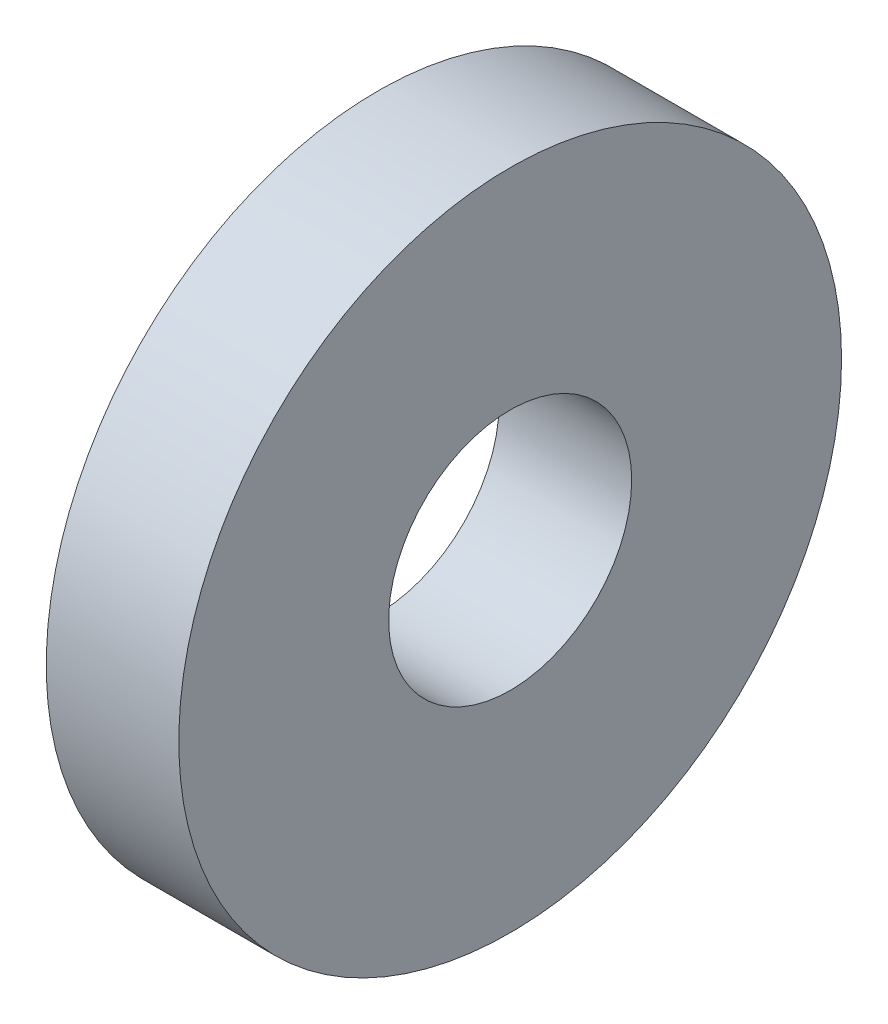
ISO-10303-21;
HEADER;
FILE_DESCRIPTION(('STEP AP214'),'2;1');
FILE_NAME('part.step','',(''),(''),'','','');
FILE_SCHEMA(('AUTOMOTIVE_DESIGN { 1 0 10303 214 1 1 1 1 }'));
ENDSEC;
DATA;
#1=APPLICATION_CONTEXT('core data for automotive mechanical design processes');
#2=APPLICATION_PROTOCOL_DEFINITION('international standard','automotive_design',2000,#1);
#3=PRODUCT_CONTEXT('',#1,'mechanical');
#4=PRODUCT('Part','Part','',(#3));
#5=PRODUCT_RELATED_PRODUCT_CATEGORY('part','',(#4));
#6=PRODUCT_DEFINITION_FORMATION('','',#4);
#7=PRODUCT_DEFINITION_CONTEXT('part definition',#1,'design');
#8=PRODUCT_DEFINITION('design','',#6,#7);
#9=PRODUCT_DEFINITION_SHAPE('','',#8);
#10=(LENGTH_UNIT() NAMED_UNIT(*) SI_UNIT(.MILLI.,.METRE.));
#11=(NAMED_UNIT(*) PLANE_ANGLE_UNIT() SI_UNIT($,.RADIAN.));
#12=(NAMED_UNIT(*) SI_UNIT($,.STERADIAN.) SOLID_ANGLE_UNIT());
#13=UNCERTAINTY_MEASURE_WITH_UNIT(LENGTH_MEASURE(1.E-05),#10,'distance_accuracy_value','');
#14=(GEOMETRIC_REPRESENTATION_CONTEXT(3) GLOBAL_UNCERTAINTY_ASSIGNED_CONTEXT((#13)) GLOBAL_UNIT_ASSIGNED_CONTEXT((#10,
#11,#12)) REPRESENTATION_CONTEXT('',''));
#15=CARTESIAN_POINT('',(0.,0.,0.));
#16=DIRECTION('',(0.,0.,1.));
#17=DIRECTION('',(1.,0.,0.));
#18=AXIS2_PLACEMENT_3D('',#15,#16,#17);
#19=CARTESIAN_POINT('',(3.,0.,0.));
#20=DIRECTION('',(1.,0.,0.));
#21=DIRECTION('',(0.,0.,-1.));
#22=AXIS2_PLACEMENT_3D('',#19,#20,#21);
#23=PLANE('',#22);
#24=CARTESIAN_POINT('',(3.,0.,0.));
#25=DIRECTION('',(1.,0.,0.));
#26=DIRECTION('',(0.,0.,-1.));
#27=AXIS2_PLACEMENT_3D('',#24,#25,#26);
#28=CIRCLE('',#27,7.5);
#29=CARTESIAN_POINT('',(3.,0.,-7.5));
#30=VERTEX_POINT('',#29);
#31=EDGE_CURVE('E10',#30,#30,#28,.T.);
#32=ORIENTED_EDGE('',*,*,#31,.T.);
#33=EDGE_LOOP('',(#32));
#34=FACE_BOUND('',#33,.T.);
#35=CARTESIAN_POINT('',(3.,0.,0.));
#36=DIRECTION('',(1.,0.,0.));
#37=DIRECTION('',(0.,0.,-1.));
#38=AXIS2_PLACEMENT_3D('',#35,#36,#37);
#39=CIRCLE('',#38,2.75);
#40=CARTESIAN_POINT('',(3.,0.,-2.75));
#41=VERTEX_POINT('',#40);
#42=EDGE_CURVE('E39',#41,#41,#39,.T.);
#43=ORIENTED_EDGE('',*,*,#42,.F.);
#44=EDGE_LOOP('',(#43));
#45=FACE_BOUND('',#44,.T.);
#46=ADVANCED_FACE('F28',(#34,#45),#23,.T.);
#47=CARTESIAN_POINT('',(0.,0.,0.));
#48=DIRECTION('',(1.,0.,0.));
#49=DIRECTION('',(0.,0.,-1.));
#50=AXIS2_PLACEMENT_3D('',#47,#48,#49);
#51=PLANE('',#50);
#52=CARTESIAN_POINT('',(0.,0.,0.));
#53=DIRECTION('',(1.,0.,0.));
#54=DIRECTION('',(0.,0.,-1.));
#55=AXIS2_PLACEMENT_3D('',#52,#53,#54);
#56=CIRCLE('',#55,7.5);
#57=CARTESIAN_POINT('',(0.,0.,-7.5));
#58=VERTEX_POINT('',#57);
#59=EDGE_CURVE('E32',#58,#58,#56,.T.);
#60=ORIENTED_EDGE('',*,*,#59,.F.);
#61=EDGE_LOOP('',(#60));
#62=FACE_BOUND('',#61,.T.);
#63=CARTESIAN_POINT('',(0.,0.,0.));
#64=DIRECTION('',(1.,0.,0.));
#65=DIRECTION('',(0.,0.,-1.));
#66=AXIS2_PLACEMENT_3D('',#63,#64,#65);
#67=CIRCLE('',#66,2.75);
#68=CARTESIAN_POINT('',(0.,0.,-2.75));
#69=VERTEX_POINT('',#68);
#70=EDGE_CURVE('E41',#69,#69,#67,.T.);
#71=ORIENTED_EDGE('',*,*,#70,.T.);
#72=EDGE_LOOP('',(#71));
#73=FACE_BOUND('',#72,.T.);
#74=ADVANCED_FACE('F51',(#62,#73),#51,.F.);
#75=CARTESIAN_POINT('',(3.,0.,0.));
#76=DIRECTION('',(-1.,0.,0.));
#77=DIRECTION('',(0.,0.,1.));
#78=AXIS2_PLACEMENT_3D('',#75,#76,#77);
#79=CYLINDRICAL_SURFACE('',#78,7.5);
#80=ORIENTED_EDGE('',*,*,#31,.F.);
#81=EDGE_LOOP('',(#80));
#82=FACE_BOUND('',#81,.T.);
#83=ORIENTED_EDGE('',*,*,#59,.T.);
#84=EDGE_LOOP('',(#83));
#85=FACE_BOUND('',#84,.T.);
#86=ADVANCED_FACE('F30',(#82,#85),#79,.T.);
#87=CARTESIAN_POINT('',(3.,0.,0.));
#88=DIRECTION('',(-1.,0.,0.));
#89=DIRECTION('',(0.,0.,1.));
#90=AXIS2_PLACEMENT_3D('',#87,#88,#89);
#91=CYLINDRICAL_SURFACE('',#90,2.75);
#92=ORIENTED_EDGE('',*,*,#42,.T.);
#93=EDGE_LOOP('',(#92));
#94=FACE_BOUND('',#93,.T.);
#95=ORIENTED_EDGE('',*,*,#70,.F.);
#96=EDGE_LOOP('',(#95));
#97=FACE_BOUND('',#96,.T.);
#98=ADVANCED_FACE('F47',(#94,#97),#91,.F.);
#99=CLOSED_SHELL('',(#46,#74,#86,#98));
#100=MANIFOLD_SOLID_BREP('B2',#99);
#101=ADVANCED_BREP_SHAPE_REPRESENTATION('',(#18,#100),#14);
#102=SHAPE_DEFINITION_REPRESENTATION(#9,#101);
ENDSEC;
END-ISO-10303-21;
